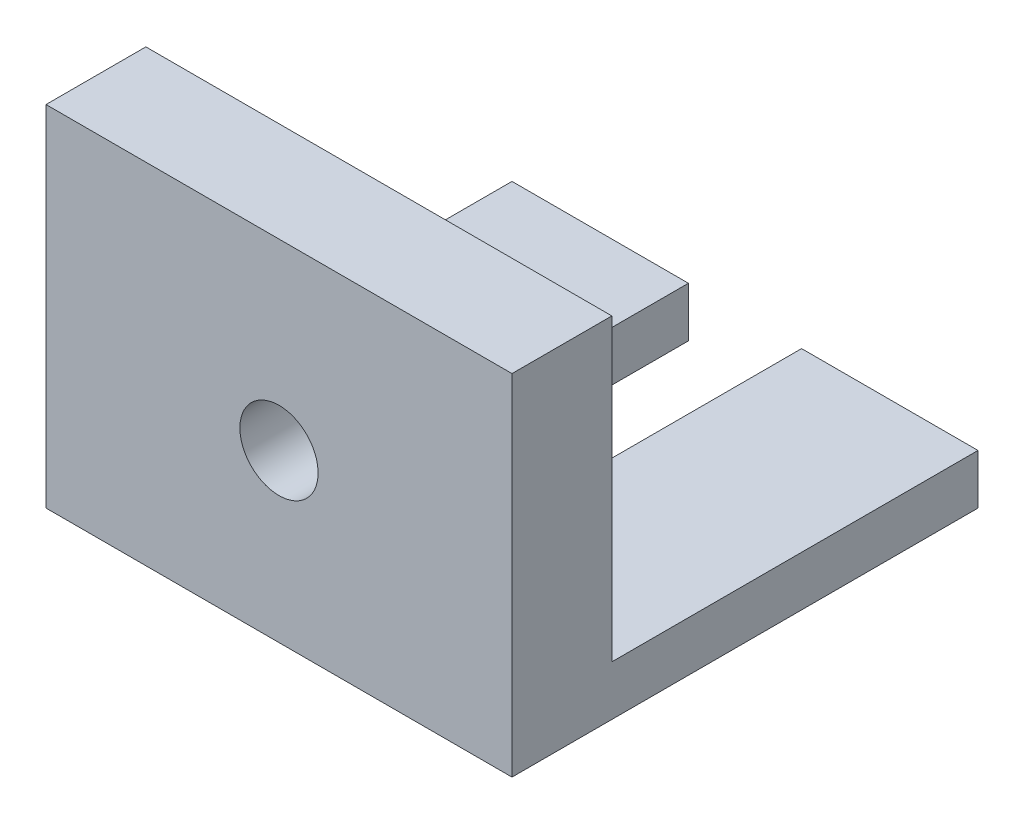
ISO-10303-21;
HEADER;
FILE_DESCRIPTION(('STEP AP214'),'2;1');
FILE_NAME('part.step','',(''),(''),'','','');
FILE_SCHEMA(('AUTOMOTIVE_DESIGN { 1 0 10303 214 1 1 1 1 }'));
ENDSEC;
DATA;
#1=APPLICATION_CONTEXT('core data for automotive mechanical design processes');
#2=APPLICATION_PROTOCOL_DEFINITION('international standard','automotive_design',2000,#1);
#3=PRODUCT_CONTEXT('',#1,'mechanical');
#4=PRODUCT('Part','Part','',(#3));
#5=PRODUCT_RELATED_PRODUCT_CATEGORY('part','',(#4));
#6=PRODUCT_DEFINITION_FORMATION('','',#4);
#7=PRODUCT_DEFINITION_CONTEXT('part definition',#1,'design');
#8=PRODUCT_DEFINITION('design','',#6,#7);
#9=PRODUCT_DEFINITION_SHAPE('','',#8);
#10=(LENGTH_UNIT() NAMED_UNIT(*) SI_UNIT(.MILLI.,.METRE.));
#11=(NAMED_UNIT(*) PLANE_ANGLE_UNIT() SI_UNIT($,.RADIAN.));
#12=(NAMED_UNIT(*) SI_UNIT($,.STERADIAN.) SOLID_ANGLE_UNIT());
#13=UNCERTAINTY_MEASURE_WITH_UNIT(LENGTH_MEASURE(1.E-05),#10,'distance_accuracy_value','');
#14=(GEOMETRIC_REPRESENTATION_CONTEXT(3) GLOBAL_UNCERTAINTY_ASSIGNED_CONTEXT((#13)) GLOBAL_UNIT_ASSIGNED_CONTEXT((#10,
#11,#12)) REPRESENTATION_CONTEXT('',''));
#15=CARTESIAN_POINT('',(0.,0.,0.));
#16=DIRECTION('',(0.,0.,1.));
#17=DIRECTION('',(1.,0.,0.));
#18=AXIS2_PLACEMENT_3D('',#15,#16,#17);
#19=CARTESIAN_POINT('',(0.,25.,0.));
#20=DIRECTION('',(0.,0.,1.));
#21=DIRECTION('',(1.,0.,0.));
#22=AXIS2_PLACEMENT_3D('',#19,#20,#21);
#23=PLANE('',#22);
#24=DIRECTION('',(-1.,0.,0.));
#25=VECTOR('',#24,1.);
#26=CARTESIAN_POINT('',(0.,3.,0.));
#27=LINE('',#26,#25);
#28=CARTESIAN_POINT('',(10.6,3.,0.));
#29=VERTEX_POINT('',#28);
#30=CARTESIAN_POINT('',(0.,3.,0.));
#31=VERTEX_POINT('',#30);
#32=EDGE_CURVE('E170',#29,#31,#27,.T.);
#33=ORIENTED_EDGE('',*,*,#32,.F.);
#34=DIRECTION('',(0.,1.,0.));
#35=VECTOR('',#34,1.);
#36=CARTESIAN_POINT('',(10.6,0.,0.));
#37=LINE('',#36,#35);
#38=CARTESIAN_POINT('',(10.6,0.,0.));
#39=VERTEX_POINT('',#38);
#40=EDGE_CURVE('E184',#39,#29,#37,.T.);
#41=ORIENTED_EDGE('',*,*,#40,.F.);
#42=DIRECTION('',(-1.,0.,0.));
#43=VECTOR('',#42,1.);
#44=CARTESIAN_POINT('',(0.,0.,0.));
#45=LINE('',#44,#43);
#46=CARTESIAN_POINT('',(0.,0.,0.));
#47=VERTEX_POINT('',#46);
#48=EDGE_CURVE('E143',#39,#47,#45,.T.);
#49=ORIENTED_EDGE('',*,*,#48,.T.);
#50=DIRECTION('',(0.,-1.,0.));
#51=VECTOR('',#50,1.);
#52=CARTESIAN_POINT('',(0.,25.,0.));
#53=LINE('',#52,#51);
#54=EDGE_CURVE('E128',#31,#47,#53,.T.);
#55=ORIENTED_EDGE('',*,*,#54,.F.);
#56=EDGE_LOOP('',(#33,#41,#49,#55));
#57=FACE_BOUND('',#56,.T.);
#58=ADVANCED_FACE('F32',(#57),#23,.F.);
#59=CARTESIAN_POINT('',(0.,3.,0.));
#60=DIRECTION('',(0.,1.,0.));
#61=DIRECTION('',(0.,0.,1.));
#62=AXIS2_PLACEMENT_3D('',#59,#60,#61);
#63=PLANE('',#62);
#64=DIRECTION('',(0.,0.,1.));
#65=VECTOR('',#64,1.);
#66=CARTESIAN_POINT('',(10.6,3.,0.));
#67=LINE('',#66,#65);
#68=CARTESIAN_POINT('',(10.6,3.,22.));
#69=VERTEX_POINT('',#68);
#70=EDGE_CURVE('E55',#29,#69,#67,.T.);
#71=ORIENTED_EDGE('',*,*,#70,.F.);
#72=ORIENTED_EDGE('',*,*,#32,.T.);
#73=DIRECTION('',(0.,0.,1.));
#74=VECTOR('',#73,1.);
#75=CARTESIAN_POINT('',(0.,3.,0.));
#76=LINE('',#75,#74);
#77=CARTESIAN_POINT('',(0.,3.,22.));
#78=VERTEX_POINT('',#77);
#79=EDGE_CURVE('E182',#31,#78,#76,.T.);
#80=ORIENTED_EDGE('',*,*,#79,.T.);
#81=DIRECTION('',(1.,0.,0.));
#82=VECTOR('',#81,1.);
#83=CARTESIAN_POINT('',(0.,3.,22.));
#84=LINE('',#83,#82);
#85=EDGE_CURVE('E171',#78,#69,#84,.T.);
#86=ORIENTED_EDGE('',*,*,#85,.T.);
#87=EDGE_LOOP('',(#71,#72,#80,#86));
#88=FACE_BOUND('',#87,.T.);
#89=ADVANCED_FACE('F208',(#88),#63,.T.);
#90=CARTESIAN_POINT('',(28.,0.,0.));
#91=VERTEX_POINT('',#90);
#92=CARTESIAN_POINT('',(17.4,0.,0.));
#93=VERTEX_POINT('',#92);
#94=EDGE_CURVE('E144',#91,#93,#45,.T.);
#95=ORIENTED_EDGE('',*,*,#94,.T.);
#96=DIRECTION('',(0.,1.,0.));
#97=VECTOR('',#96,1.);
#98=CARTESIAN_POINT('',(17.4,0.,0.));
#99=LINE('',#98,#97);
#100=CARTESIAN_POINT('',(17.4,3.,0.));
#101=VERTEX_POINT('',#100);
#102=EDGE_CURVE('E163',#93,#101,#99,.T.);
#103=ORIENTED_EDGE('',*,*,#102,.T.);
#104=CARTESIAN_POINT('',(28.,3.,0.));
#105=VERTEX_POINT('',#104);
#106=EDGE_CURVE('E165',#105,#101,#27,.T.);
#107=ORIENTED_EDGE('',*,*,#106,.F.);
#108=DIRECTION('',(0.,-1.,0.));
#109=VECTOR('',#108,1.);
#110=CARTESIAN_POINT('',(28.,25.,0.));
#111=LINE('',#110,#109);
#112=EDGE_CURVE('E148',#105,#91,#111,.T.);
#113=ORIENTED_EDGE('',*,*,#112,.T.);
#114=EDGE_LOOP('',(#95,#103,#107,#113));
#115=FACE_BOUND('',#114,.T.);
#116=ADVANCED_FACE('F161',(#115),#23,.F.);
#117=CARTESIAN_POINT('',(0.,25.,0.));
#118=DIRECTION('',(1.,0.,0.));
#119=DIRECTION('',(0.,0.,-1.));
#120=AXIS2_PLACEMENT_3D('',#117,#118,#119);
#121=PLANE('',#120);
#122=DIRECTION('',(0.,-1.,0.));
#123=VECTOR('',#122,1.);
#124=CARTESIAN_POINT('',(0.,25.,28.));
#125=LINE('',#124,#123);
#126=CARTESIAN_POINT('',(0.,21.,28.));
#127=VERTEX_POINT('',#126);
#128=CARTESIAN_POINT('',(0.,0.,28.));
#129=VERTEX_POINT('',#128);
#130=EDGE_CURVE('E11',#127,#129,#125,.T.);
#131=ORIENTED_EDGE('',*,*,#130,.F.);
#132=DIRECTION('',(0.,0.,1.));
#133=VECTOR('',#132,1.);
#134=CARTESIAN_POINT('',(0.,21.,28.));
#135=LINE('',#134,#133);
#136=CARTESIAN_POINT('',(0.,21.,22.));
#137=VERTEX_POINT('',#136);
#138=EDGE_CURVE('E106',#137,#127,#135,.T.);
#139=ORIENTED_EDGE('',*,*,#138,.F.);
#140=DIRECTION('',(0.,1.,0.));
#141=VECTOR('',#140,1.);
#142=CARTESIAN_POINT('',(0.,3.,22.));
#143=LINE('',#142,#141);
#144=EDGE_CURVE('E137',#78,#137,#143,.T.);
#145=ORIENTED_EDGE('',*,*,#144,.F.);
#146=ORIENTED_EDGE('',*,*,#79,.F.);
#147=ORIENTED_EDGE('',*,*,#54,.T.);
#148=DIRECTION('',(0.,0.,1.));
#149=VECTOR('',#148,1.);
#150=CARTESIAN_POINT('',(0.,0.,0.));
#151=LINE('',#150,#149);
#152=EDGE_CURVE('E125',#47,#129,#151,.T.);
#153=ORIENTED_EDGE('',*,*,#152,.T.);
#154=EDGE_LOOP('',(#131,#139,#145,#146,#147,#153));
#155=FACE_BOUND('',#154,.T.);
#156=ADVANCED_FACE('F34',(#155),#121,.F.);
#157=CARTESIAN_POINT('',(0.,25.,28.));
#158=DIRECTION('',(0.,0.,-1.));
#159=DIRECTION('',(-1.,0.,0.));
#160=AXIS2_PLACEMENT_3D('',#157,#158,#159);
#161=PLANE('',#160);
#162=CARTESIAN_POINT('',(14.,10.,28.));
#163=DIRECTION('',(0.,0.,-1.));
#164=DIRECTION('',(-1.,0.,0.));
#165=AXIS2_PLACEMENT_3D('',#162,#163,#164);
#166=CIRCLE('',#165,2.35);
#167=CARTESIAN_POINT('',(11.65,10.,28.));
#168=VERTEX_POINT('',#167);
#169=EDGE_CURVE('E202',#168,#168,#166,.T.);
#170=ORIENTED_EDGE('',*,*,#169,.T.);
#171=EDGE_LOOP('',(#170));
#172=FACE_BOUND('',#171,.T.);
#173=DIRECTION('',(0.,-1.,0.));
#174=VECTOR('',#173,1.);
#175=CARTESIAN_POINT('',(28.,25.,28.));
#176=LINE('',#175,#174);
#177=CARTESIAN_POINT('',(28.,21.,28.));
#178=VERTEX_POINT('',#177);
#179=CARTESIAN_POINT('',(28.,0.,28.));
#180=VERTEX_POINT('',#179);
#181=EDGE_CURVE('E40',#178,#180,#176,.T.);
#182=ORIENTED_EDGE('',*,*,#181,.F.);
#183=DIRECTION('',(1.,0.,0.));
#184=VECTOR('',#183,1.);
#185=CARTESIAN_POINT('',(0.,21.,28.));
#186=LINE('',#185,#184);
#187=EDGE_CURVE('E109',#127,#178,#186,.T.);
#188=ORIENTED_EDGE('',*,*,#187,.F.);
#189=ORIENTED_EDGE('',*,*,#130,.T.);
#190=DIRECTION('',(1.,0.,0.));
#191=VECTOR('',#190,1.);
#192=CARTESIAN_POINT('',(0.,0.,28.));
#193=LINE('',#192,#191);
#194=EDGE_CURVE('E131',#129,#180,#193,.T.);
#195=ORIENTED_EDGE('',*,*,#194,.T.);
#196=EDGE_LOOP('',(#182,#188,#189,#195));
#197=FACE_BOUND('',#196,.T.);
#198=ADVANCED_FACE('F118',(#172,#197),#161,.F.);
#199=CARTESIAN_POINT('',(28.,25.,0.));
#200=DIRECTION('',(-1.,0.,0.));
#201=DIRECTION('',(0.,0.,1.));
#202=AXIS2_PLACEMENT_3D('',#199,#200,#201);
#203=PLANE('',#202);
#204=DIRECTION('',(0.,1.,0.));
#205=VECTOR('',#204,1.);
#206=CARTESIAN_POINT('',(28.,3.,22.));
#207=LINE('',#206,#205);
#208=CARTESIAN_POINT('',(28.,3.,22.));
#209=VERTEX_POINT('',#208);
#210=CARTESIAN_POINT('',(28.,21.,22.));
#211=VERTEX_POINT('',#210);
#212=EDGE_CURVE('E132',#209,#211,#207,.T.);
#213=ORIENTED_EDGE('',*,*,#212,.T.);
#214=DIRECTION('',(0.,0.,-1.));
#215=VECTOR('',#214,1.);
#216=CARTESIAN_POINT('',(28.,21.,28.));
#217=LINE('',#216,#215);
#218=EDGE_CURVE('E47',#178,#211,#217,.T.);
#219=ORIENTED_EDGE('',*,*,#218,.F.);
#220=ORIENTED_EDGE('',*,*,#181,.T.);
#221=DIRECTION('',(0.,0.,-1.));
#222=VECTOR('',#221,1.);
#223=CARTESIAN_POINT('',(28.,0.,0.));
#224=LINE('',#223,#222);
#225=EDGE_CURVE('E134',#180,#91,#224,.T.);
#226=ORIENTED_EDGE('',*,*,#225,.T.);
#227=ORIENTED_EDGE('',*,*,#112,.F.);
#228=DIRECTION('',(0.,0.,-1.));
#229=VECTOR('',#228,1.);
#230=CARTESIAN_POINT('',(28.,3.,0.));
#231=LINE('',#230,#229);
#232=EDGE_CURVE('E167',#209,#105,#231,.T.);
#233=ORIENTED_EDGE('',*,*,#232,.F.);
#234=EDGE_LOOP('',(#213,#219,#220,#226,#227,#233));
#235=FACE_BOUND('',#234,.T.);
#236=ADVANCED_FACE('F150',(#235),#203,.F.);
#237=CARTESIAN_POINT('',(0.,0.,0.));
#238=DIRECTION('',(0.,1.,0.));
#239=DIRECTION('',(0.,0.,1.));
#240=AXIS2_PLACEMENT_3D('',#237,#238,#239);
#241=PLANE('',#240);
#242=ORIENTED_EDGE('',*,*,#48,.F.);
#243=DIRECTION('',(0.,0.,1.));
#244=VECTOR('',#243,1.);
#245=CARTESIAN_POINT('',(10.6,0.,0.));
#246=LINE('',#245,#244);
#247=CARTESIAN_POINT('',(10.6,0.,22.));
#248=VERTEX_POINT('',#247);
#249=EDGE_CURVE('E189',#39,#248,#246,.T.);
#250=ORIENTED_EDGE('',*,*,#249,.T.);
#251=DIRECTION('',(1.,0.,0.));
#252=VECTOR('',#251,1.);
#253=CARTESIAN_POINT('',(10.6,0.,22.));
#254=LINE('',#253,#252);
#255=CARTESIAN_POINT('',(17.4,0.,22.));
#256=VERTEX_POINT('',#255);
#257=EDGE_CURVE('E191',#248,#256,#254,.T.);
#258=ORIENTED_EDGE('',*,*,#257,.T.);
#259=DIRECTION('',(0.,0.,-1.));
#260=VECTOR('',#259,1.);
#261=CARTESIAN_POINT('',(17.4,0.,0.));
#262=LINE('',#261,#260);
#263=EDGE_CURVE('E158',#256,#93,#262,.T.);
#264=ORIENTED_EDGE('',*,*,#263,.T.);
#265=ORIENTED_EDGE('',*,*,#94,.F.);
#266=ORIENTED_EDGE('',*,*,#225,.F.);
#267=ORIENTED_EDGE('',*,*,#194,.F.);
#268=ORIENTED_EDGE('',*,*,#152,.F.);
#269=EDGE_LOOP('',(#242,#250,#258,#264,#265,#266,#267,#268));
#270=FACE_BOUND('',#269,.T.);
#271=ADVANCED_FACE('F154',(#270),#241,.F.);
#272=CARTESIAN_POINT('',(0.,3.,22.));
#273=DIRECTION('',(0.,0.,1.));
#274=DIRECTION('',(1.,0.,0.));
#275=AXIS2_PLACEMENT_3D('',#272,#273,#274);
#276=PLANE('',#275);
#277=CARTESIAN_POINT('',(14.,10.,22.));
#278=DIRECTION('',(0.,0.,-1.));
#279=DIRECTION('',(-1.,0.,0.));
#280=AXIS2_PLACEMENT_3D('',#277,#278,#279);
#281=CIRCLE('',#280,2.35);
#282=CARTESIAN_POINT('',(11.65,10.,22.));
#283=VERTEX_POINT('',#282);
#284=EDGE_CURVE('E197',#283,#283,#281,.T.);
#285=ORIENTED_EDGE('',*,*,#284,.F.);
#286=EDGE_LOOP('',(#285));
#287=FACE_BOUND('',#286,.T.);
#288=ORIENTED_EDGE('',*,*,#144,.T.);
#289=DIRECTION('',(-1.,0.,0.));
#290=VECTOR('',#289,1.);
#291=CARTESIAN_POINT('',(0.,21.,22.));
#292=LINE('',#291,#290);
#293=EDGE_CURVE('E110',#211,#137,#292,.T.);
#294=ORIENTED_EDGE('',*,*,#293,.F.);
#295=ORIENTED_EDGE('',*,*,#212,.F.);
#296=CARTESIAN_POINT('',(17.4,3.,22.));
#297=VERTEX_POINT('',#296);
#298=EDGE_CURVE('E175',#297,#209,#84,.T.);
#299=ORIENTED_EDGE('',*,*,#298,.F.);
#300=DIRECTION('',(0.,1.,0.));
#301=VECTOR('',#300,1.);
#302=CARTESIAN_POINT('',(17.4,0.,22.));
#303=LINE('',#302,#301);
#304=EDGE_CURVE('E206',#256,#297,#303,.T.);
#305=ORIENTED_EDGE('',*,*,#304,.F.);
#306=ORIENTED_EDGE('',*,*,#257,.F.);
#307=DIRECTION('',(0.,1.,0.));
#308=VECTOR('',#307,1.);
#309=CARTESIAN_POINT('',(10.6,0.,22.));
#310=LINE('',#309,#308);
#311=EDGE_CURVE('E201',#248,#69,#310,.T.);
#312=ORIENTED_EDGE('',*,*,#311,.T.);
#313=ORIENTED_EDGE('',*,*,#85,.F.);
#314=EDGE_LOOP('',(#288,#294,#295,#299,#305,#306,#312,#313));
#315=FACE_BOUND('',#314,.T.);
#316=ADVANCED_FACE('F180',(#287,#315),#276,.F.);
#317=DIRECTION('',(0.,0.,-1.));
#318=VECTOR('',#317,1.);
#319=CARTESIAN_POINT('',(17.4,3.,0.));
#320=LINE('',#319,#318);
#321=EDGE_CURVE('E192',#297,#101,#320,.T.);
#322=ORIENTED_EDGE('',*,*,#321,.F.);
#323=ORIENTED_EDGE('',*,*,#298,.T.);
#324=ORIENTED_EDGE('',*,*,#232,.T.);
#325=ORIENTED_EDGE('',*,*,#106,.T.);
#326=EDGE_LOOP('',(#322,#323,#324,#325));
#327=FACE_BOUND('',#326,.T.);
#328=ADVANCED_FACE('F211',(#327),#63,.T.);
#329=CARTESIAN_POINT('',(10.6,0.,0.));
#330=DIRECTION('',(-1.,0.,0.));
#331=DIRECTION('',(0.,0.,1.));
#332=AXIS2_PLACEMENT_3D('',#329,#330,#331);
#333=PLANE('',#332);
#334=ORIENTED_EDGE('',*,*,#70,.T.);
#335=ORIENTED_EDGE('',*,*,#311,.F.);
#336=ORIENTED_EDGE('',*,*,#249,.F.);
#337=ORIENTED_EDGE('',*,*,#40,.T.);
#338=EDGE_LOOP('',(#334,#335,#336,#337));
#339=FACE_BOUND('',#338,.T.);
#340=ADVANCED_FACE('F220',(#339),#333,.F.);
#341=CARTESIAN_POINT('',(17.4,0.,0.));
#342=DIRECTION('',(1.,0.,0.));
#343=DIRECTION('',(0.,0.,-1.));
#344=AXIS2_PLACEMENT_3D('',#341,#342,#343);
#345=PLANE('',#344);
#346=ORIENTED_EDGE('',*,*,#321,.T.);
#347=ORIENTED_EDGE('',*,*,#102,.F.);
#348=ORIENTED_EDGE('',*,*,#263,.F.);
#349=ORIENTED_EDGE('',*,*,#304,.T.);
#350=EDGE_LOOP('',(#346,#347,#348,#349));
#351=FACE_BOUND('',#350,.T.);
#352=ADVANCED_FACE('F225',(#351),#345,.F.);
#353=CARTESIAN_POINT('',(14.,10.,28.));
#354=DIRECTION('',(0.,0.,-1.));
#355=DIRECTION('',(-1.,0.,0.));
#356=AXIS2_PLACEMENT_3D('',#353,#354,#355);
#357=CYLINDRICAL_SURFACE('',#356,2.35);
#358=ORIENTED_EDGE('',*,*,#169,.F.);
#359=EDGE_LOOP('',(#358));
#360=FACE_BOUND('',#359,.T.);
#361=ORIENTED_EDGE('',*,*,#284,.T.);
#362=EDGE_LOOP('',(#361));
#363=FACE_BOUND('',#362,.T.);
#364=ADVANCED_FACE('F230',(#360,#363),#357,.F.);
#365=CARTESIAN_POINT('',(0.,21.,0.));
#366=DIRECTION('',(0.,-1.,0.));
#367=DIRECTION('',(0.,0.,-1.));
#368=AXIS2_PLACEMENT_3D('',#365,#366,#367);
#369=PLANE('',#368);
#370=ORIENTED_EDGE('',*,*,#138,.T.);
#371=ORIENTED_EDGE('',*,*,#187,.T.);
#372=ORIENTED_EDGE('',*,*,#218,.T.);
#373=ORIENTED_EDGE('',*,*,#293,.T.);
#374=EDGE_LOOP('',(#370,#371,#372,#373));
#375=FACE_BOUND('',#374,.T.);
#376=ADVANCED_FACE('F108',(#375),#369,.F.);
#377=CLOSED_SHELL('',(#58,#89,#116,#156,#198,#236,#271,#316,#328,#340,#352,#364,#376));
#378=MANIFOLD_SOLID_BREP('B2',#377);
#379=ADVANCED_BREP_SHAPE_REPRESENTATION('',(#18,#378),#14);
#380=SHAPE_DEFINITION_REPRESENTATION(#9,#379);
ENDSEC;
END-ISO-10303-21;
